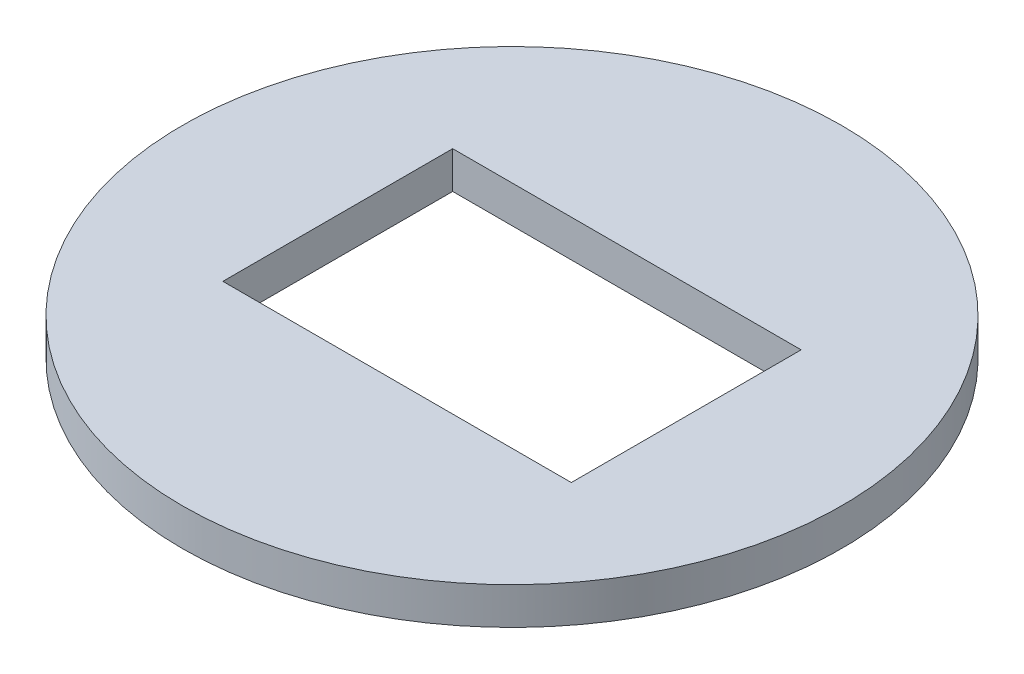
ISO-10303-21;
HEADER;
FILE_DESCRIPTION(('STEP AP214'),'2;1');
FILE_NAME('part.step','',(''),(''),'','','');
FILE_SCHEMA(('AUTOMOTIVE_DESIGN { 1 0 10303 214 1 1 1 1 }'));
ENDSEC;
DATA;
#1=APPLICATION_CONTEXT('core data for automotive mechanical design processes');
#2=APPLICATION_PROTOCOL_DEFINITION('international standard','automotive_design',2000,#1);
#3=PRODUCT_CONTEXT('',#1,'mechanical');
#4=PRODUCT('Part','Part','',(#3));
#5=PRODUCT_RELATED_PRODUCT_CATEGORY('part','',(#4));
#6=PRODUCT_DEFINITION_FORMATION('','',#4);
#7=PRODUCT_DEFINITION_CONTEXT('part definition',#1,'design');
#8=PRODUCT_DEFINITION('design','',#6,#7);
#9=PRODUCT_DEFINITION_SHAPE('','',#8);
#10=(LENGTH_UNIT() NAMED_UNIT(*) SI_UNIT(.MILLI.,.METRE.));
#11=(NAMED_UNIT(*) PLANE_ANGLE_UNIT() SI_UNIT($,.RADIAN.));
#12=(NAMED_UNIT(*) SI_UNIT($,.STERADIAN.) SOLID_ANGLE_UNIT());
#13=UNCERTAINTY_MEASURE_WITH_UNIT(LENGTH_MEASURE(1.E-05),#10,'distance_accuracy_value','');
#14=(GEOMETRIC_REPRESENTATION_CONTEXT(3) GLOBAL_UNCERTAINTY_ASSIGNED_CONTEXT((#13)) GLOBAL_UNIT_ASSIGNED_CONTEXT((#10,
#11,#12)) REPRESENTATION_CONTEXT('',''));
#15=CARTESIAN_POINT('',(0.,0.,0.));
#16=DIRECTION('',(0.,0.,1.));
#17=DIRECTION('',(1.,0.,0.));
#18=AXIS2_PLACEMENT_3D('',#15,#16,#17);
#19=CARTESIAN_POINT('',(0.,10.,0.));
#20=DIRECTION('',(0.,-1.,0.));
#21=DIRECTION('',(0.,0.,-1.));
#22=AXIS2_PLACEMENT_3D('',#19,#20,#21);
#23=CYLINDRICAL_SURFACE('',#22,88.9);
#24=CARTESIAN_POINT('',(0.,10.,0.));
#25=DIRECTION('',(0.,1.,0.));
#26=DIRECTION('',(0.,0.,1.));
#27=AXIS2_PLACEMENT_3D('',#24,#25,#26);
#28=CIRCLE('',#27,88.9);
#29=CARTESIAN_POINT('',(0.,10.,88.9));
#30=VERTEX_POINT('',#29);
#31=EDGE_CURVE('E101',#30,#30,#28,.T.);
#32=ORIENTED_EDGE('',*,*,#31,.F.);
#33=EDGE_LOOP('',(#32));
#34=FACE_BOUND('',#33,.T.);
#35=CARTESIAN_POINT('',(0.,0.,0.));
#36=DIRECTION('',(0.,1.,0.));
#37=DIRECTION('',(0.,0.,1.));
#38=AXIS2_PLACEMENT_3D('',#35,#36,#37);
#39=CIRCLE('',#38,88.9);
#40=CARTESIAN_POINT('',(0.,0.,88.9));
#41=VERTEX_POINT('',#40);
#42=EDGE_CURVE('E96',#41,#41,#39,.T.);
#43=ORIENTED_EDGE('',*,*,#42,.T.);
#44=EDGE_LOOP('',(#43));
#45=FACE_BOUND('',#44,.T.);
#46=ADVANCED_FACE('F33',(#34,#45),#23,.T.);
#47=CARTESIAN_POINT('',(0.,10.,0.));
#48=DIRECTION('',(0.,1.,0.));
#49=DIRECTION('',(0.,0.,1.));
#50=AXIS2_PLACEMENT_3D('',#47,#48,#49);
#51=PLANE('',#50);
#52=DIRECTION('',(0.,0.,1.));
#53=VECTOR('',#52,1.);
#54=CARTESIAN_POINT('',(47.,9.99999999999999,31.));
#55=LINE('',#54,#53);
#56=CARTESIAN_POINT('',(47.,9.99999999999999,-31.));
#57=VERTEX_POINT('',#56);
#58=CARTESIAN_POINT('',(47.,9.99999999999999,31.));
#59=VERTEX_POINT('',#58);
#60=EDGE_CURVE('E76',#57,#59,#55,.T.);
#61=ORIENTED_EDGE('',*,*,#60,.T.);
#62=DIRECTION('',(-1.,0.,0.));
#63=VECTOR('',#62,1.);
#64=CARTESIAN_POINT('',(-47.,9.99999999999999,31.));
#65=LINE('',#64,#63);
#66=CARTESIAN_POINT('',(-47.,10.,31.));
#67=VERTEX_POINT('',#66);
#68=EDGE_CURVE('E83',#59,#67,#65,.T.);
#69=ORIENTED_EDGE('',*,*,#68,.T.);
#70=DIRECTION('',(0.,0.,-1.));
#71=VECTOR('',#70,1.);
#72=CARTESIAN_POINT('',(-47.,9.99999999999999,31.));
#73=LINE('',#72,#71);
#74=CARTESIAN_POINT('',(-47.,9.99999999999999,-31.));
#75=VERTEX_POINT('',#74);
#76=EDGE_CURVE('E47',#67,#75,#73,.T.);
#77=ORIENTED_EDGE('',*,*,#76,.T.);
#78=DIRECTION('',(1.,0.,0.));
#79=VECTOR('',#78,1.);
#80=CARTESIAN_POINT('',(-47.,9.99999999999999,-31.));
#81=LINE('',#80,#79);
#82=EDGE_CURVE('E80',#75,#57,#81,.T.);
#83=ORIENTED_EDGE('',*,*,#82,.T.);
#84=EDGE_LOOP('',(#61,#69,#77,#83));
#85=FACE_BOUND('',#84,.T.);
#86=ORIENTED_EDGE('',*,*,#31,.T.);
#87=EDGE_LOOP('',(#86));
#88=FACE_BOUND('',#87,.T.);
#89=ADVANCED_FACE('F87',(#85,#88),#51,.T.);
#90=CARTESIAN_POINT('',(0.,0.,0.));
#91=DIRECTION('',(0.,1.,0.));
#92=DIRECTION('',(0.,0.,1.));
#93=AXIS2_PLACEMENT_3D('',#90,#91,#92);
#94=PLANE('',#93);
#95=DIRECTION('',(1.,0.,0.));
#96=VECTOR('',#95,1.);
#97=CARTESIAN_POINT('',(0.,0.,31.));
#98=LINE('',#97,#96);
#99=CARTESIAN_POINT('',(-47.,0.,31.));
#100=VERTEX_POINT('',#99);
#101=CARTESIAN_POINT('',(47.,0.,31.));
#102=VERTEX_POINT('',#101);
#103=EDGE_CURVE('E104',#100,#102,#98,.T.);
#104=ORIENTED_EDGE('',*,*,#103,.T.);
#105=DIRECTION('',(0.,0.,-1.));
#106=VECTOR('',#105,1.);
#107=CARTESIAN_POINT('',(47.,0.,0.));
#108=LINE('',#107,#106);
#109=CARTESIAN_POINT('',(47.,0.,-31.));
#110=VERTEX_POINT('',#109);
#111=EDGE_CURVE('E11',#102,#110,#108,.T.);
#112=ORIENTED_EDGE('',*,*,#111,.T.);
#113=DIRECTION('',(-1.,0.,0.));
#114=VECTOR('',#113,1.);
#115=CARTESIAN_POINT('',(0.,0.,-31.));
#116=LINE('',#115,#114);
#117=CARTESIAN_POINT('',(-47.,0.,-31.));
#118=VERTEX_POINT('',#117);
#119=EDGE_CURVE('E40',#110,#118,#116,.T.);
#120=ORIENTED_EDGE('',*,*,#119,.T.);
#121=DIRECTION('',(0.,0.,1.));
#122=VECTOR('',#121,1.);
#123=CARTESIAN_POINT('',(-47.,0.,0.));
#124=LINE('',#123,#122);
#125=EDGE_CURVE('E108',#118,#100,#124,.T.);
#126=ORIENTED_EDGE('',*,*,#125,.T.);
#127=EDGE_LOOP('',(#104,#112,#120,#126));
#128=FACE_BOUND('',#127,.T.);
#129=ORIENTED_EDGE('',*,*,#42,.F.);
#130=EDGE_LOOP('',(#129));
#131=FACE_BOUND('',#130,.T.);
#132=ADVANCED_FACE('F112',(#128,#131),#94,.F.);
#133=CARTESIAN_POINT('',(47.,9.99999999999999,31.));
#134=DIRECTION('',(1.,0.,0.));
#135=DIRECTION('',(0.,0.,-1.));
#136=AXIS2_PLACEMENT_3D('',#133,#134,#135);
#137=PLANE('',#136);
#138=DIRECTION('',(0.,-1.,0.));
#139=VECTOR('',#138,1.);
#140=CARTESIAN_POINT('',(47.,9.99999999999999,31.));
#141=LINE('',#140,#139);
#142=EDGE_CURVE('E55',#59,#102,#141,.T.);
#143=ORIENTED_EDGE('',*,*,#142,.F.);
#144=ORIENTED_EDGE('',*,*,#60,.F.);
#145=DIRECTION('',(0.,-1.,0.));
#146=VECTOR('',#145,1.);
#147=CARTESIAN_POINT('',(47.,9.99999999999999,-31.));
#148=LINE('',#147,#146);
#149=EDGE_CURVE('E94',#57,#110,#148,.T.);
#150=ORIENTED_EDGE('',*,*,#149,.T.);
#151=ORIENTED_EDGE('',*,*,#111,.F.);
#152=EDGE_LOOP('',(#143,#144,#150,#151));
#153=FACE_BOUND('',#152,.T.);
#154=ADVANCED_FACE('F73',(#153),#137,.F.);
#155=CARTESIAN_POINT('',(-47.,9.99999999999999,-31.));
#156=DIRECTION('',(0.,0.,-1.));
#157=DIRECTION('',(-1.,0.,0.));
#158=AXIS2_PLACEMENT_3D('',#155,#156,#157);
#159=PLANE('',#158);
#160=ORIENTED_EDGE('',*,*,#149,.F.);
#161=ORIENTED_EDGE('',*,*,#82,.F.);
#162=DIRECTION('',(0.,-1.,0.));
#163=VECTOR('',#162,1.);
#164=CARTESIAN_POINT('',(-47.,9.99999999999999,-31.));
#165=LINE('',#164,#163);
#166=EDGE_CURVE('E97',#75,#118,#165,.T.);
#167=ORIENTED_EDGE('',*,*,#166,.T.);
#168=ORIENTED_EDGE('',*,*,#119,.F.);
#169=EDGE_LOOP('',(#160,#161,#167,#168));
#170=FACE_BOUND('',#169,.T.);
#171=ADVANCED_FACE('F115',(#170),#159,.F.);
#172=CARTESIAN_POINT('',(-47.,9.99999999999999,31.));
#173=DIRECTION('',(-1.,0.,0.));
#174=DIRECTION('',(0.,0.,1.));
#175=AXIS2_PLACEMENT_3D('',#172,#173,#174);
#176=PLANE('',#175);
#177=ORIENTED_EDGE('',*,*,#166,.F.);
#178=ORIENTED_EDGE('',*,*,#76,.F.);
#179=DIRECTION('',(0.,-1.,0.));
#180=VECTOR('',#179,1.);
#181=CARTESIAN_POINT('',(-47.,9.99999999999999,31.));
#182=LINE('',#181,#180);
#183=EDGE_CURVE('E79',#67,#100,#182,.T.);
#184=ORIENTED_EDGE('',*,*,#183,.T.);
#185=ORIENTED_EDGE('',*,*,#125,.F.);
#186=EDGE_LOOP('',(#177,#178,#184,#185));
#187=FACE_BOUND('',#186,.T.);
#188=ADVANCED_FACE('F116',(#187),#176,.F.);
#189=CARTESIAN_POINT('',(-47.,9.99999999999999,31.));
#190=DIRECTION('',(0.,0.,1.));
#191=DIRECTION('',(1.,0.,0.));
#192=AXIS2_PLACEMENT_3D('',#189,#190,#191);
#193=PLANE('',#192);
#194=ORIENTED_EDGE('',*,*,#183,.F.);
#195=ORIENTED_EDGE('',*,*,#68,.F.);
#196=ORIENTED_EDGE('',*,*,#142,.T.);
#197=ORIENTED_EDGE('',*,*,#103,.F.);
#198=EDGE_LOOP('',(#194,#195,#196,#197));
#199=FACE_BOUND('',#198,.T.);
#200=ADVANCED_FACE('F84',(#199),#193,.F.);
#201=CLOSED_SHELL('',(#46,#89,#132,#154,#171,#188,#200));
#202=MANIFOLD_SOLID_BREP('B2',#201);
#203=ADVANCED_BREP_SHAPE_REPRESENTATION('',(#18,#202),#14);
#204=SHAPE_DEFINITION_REPRESENTATION(#9,#203);
ENDSEC;
END-ISO-10303-21;
